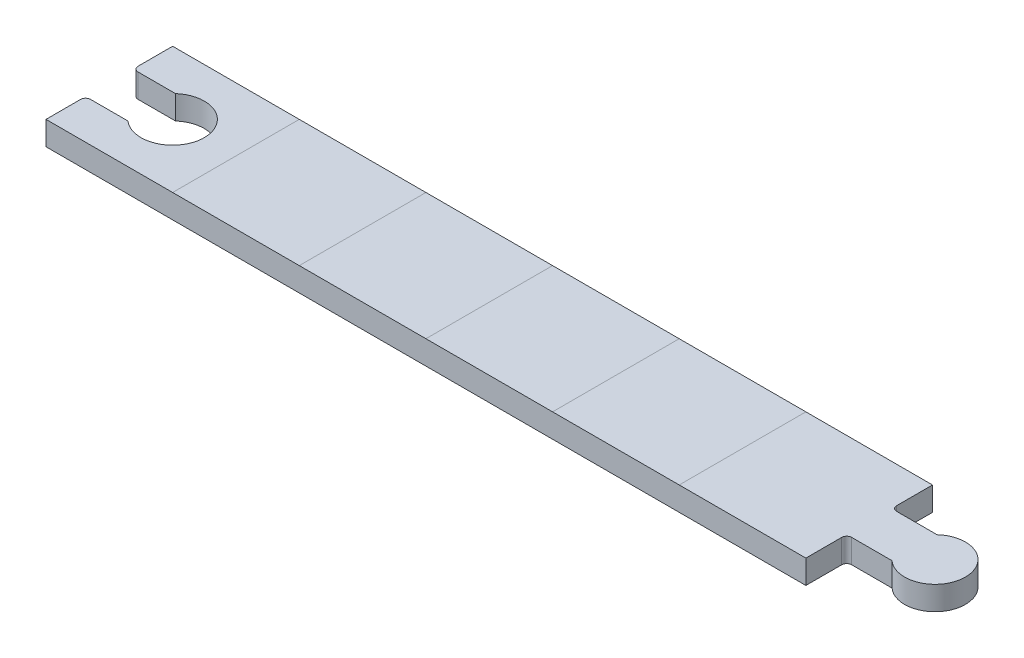
ISO-10303-21;
HEADER;
FILE_DESCRIPTION(('STEP AP214'),'2;1');
FILE_NAME('part.step','',(''),(''),'','','');
FILE_SCHEMA(('AUTOMOTIVE_DESIGN { 1 0 10303 214 1 1 1 1 }'));
ENDSEC;
DATA;
#1=APPLICATION_CONTEXT('core data for automotive mechanical design processes');
#2=APPLICATION_PROTOCOL_DEFINITION('international standard','automotive_design',2000,#1);
#3=PRODUCT_CONTEXT('',#1,'mechanical');
#4=PRODUCT('Part','Part','',(#3));
#5=PRODUCT_RELATED_PRODUCT_CATEGORY('part','',(#4));
#6=PRODUCT_DEFINITION_FORMATION('','',#4);
#7=PRODUCT_DEFINITION_CONTEXT('part definition',#1,'design');
#8=PRODUCT_DEFINITION('design','',#6,#7);
#9=PRODUCT_DEFINITION_SHAPE('','',#8);
#10=(LENGTH_UNIT() NAMED_UNIT(*) SI_UNIT(.MILLI.,.METRE.));
#11=(NAMED_UNIT(*) PLANE_ANGLE_UNIT() SI_UNIT($,.RADIAN.));
#12=(NAMED_UNIT(*) SI_UNIT($,.STERADIAN.) SOLID_ANGLE_UNIT());
#13=UNCERTAINTY_MEASURE_WITH_UNIT(LENGTH_MEASURE(1.E-05),#10,'distance_accuracy_value','');
#14=(GEOMETRIC_REPRESENTATION_CONTEXT(3) GLOBAL_UNCERTAINTY_ASSIGNED_CONTEXT((#13)) GLOBAL_UNIT_ASSIGNED_CONTEXT((#10,
#11,#12)) REPRESENTATION_CONTEXT('',''));
#15=CARTESIAN_POINT('',(0.,0.,0.));
#16=DIRECTION('',(0.,0.,1.));
#17=DIRECTION('',(1.,0.,0.));
#18=AXIS2_PLACEMENT_3D('',#15,#16,#17);
#19=CARTESIAN_POINT('',(-63.5,4.7625,0.));
#20=DIRECTION('',(0.,1.,0.));
#21=DIRECTION('',(0.,0.,1.));
#22=AXIS2_PLACEMENT_3D('',#19,#20,#21);
#23=PLANE('',#22);
#24=DIRECTION('',(1.,0.,0.));
#25=VECTOR('',#24,1.);
#26=CARTESIAN_POINT('',(-76.2,4.7625,12.7));
#27=LINE('',#26,#25);
#28=CARTESIAN_POINT('',(25.4,4.7625,12.7));
#29=VERTEX_POINT('',#28);
#30=CARTESIAN_POINT('',(50.8,4.7625,12.7));
#31=VERTEX_POINT('',#30);
#32=EDGE_CURVE('E381',#29,#31,#27,.T.);
#33=ORIENTED_EDGE('',*,*,#32,.T.);
#34=DIRECTION('',(0.,0.,-1.));
#35=VECTOR('',#34,1.);
#36=CARTESIAN_POINT('',(50.8,4.7625,0.));
#37=LINE('',#36,#35);
#38=CARTESIAN_POINT('',(50.8,4.7625,-12.7));
#39=VERTEX_POINT('',#38);
#40=EDGE_CURVE('E11',#31,#39,#37,.T.);
#41=ORIENTED_EDGE('',*,*,#40,.T.);
#42=DIRECTION('',(-1.,0.,0.));
#43=VECTOR('',#42,1.);
#44=CARTESIAN_POINT('',(-76.2,4.7625,-12.7));
#45=LINE('',#44,#43);
#46=CARTESIAN_POINT('',(25.4,4.7625,-12.7));
#47=VERTEX_POINT('',#46);
#48=EDGE_CURVE('E197',#39,#47,#45,.T.);
#49=ORIENTED_EDGE('',*,*,#48,.T.);
#50=DIRECTION('',(0.,0.,-1.));
#51=VECTOR('',#50,1.);
#52=CARTESIAN_POINT('',(25.4,4.7625,0.));
#53=LINE('',#52,#51);
#54=EDGE_CURVE('E48',#29,#47,#53,.T.);
#55=ORIENTED_EDGE('',*,*,#54,.F.);
#56=EDGE_LOOP('',(#33,#41,#49,#55));
#57=FACE_BOUND('',#56,.T.);
#58=ADVANCED_FACE('F39',(#57),#23,.T.);
#59=CARTESIAN_POINT('',(0.,4.7625,12.7));
#60=VERTEX_POINT('',#59);
#61=EDGE_CURVE('E265',#60,#29,#27,.T.);
#62=ORIENTED_EDGE('',*,*,#61,.T.);
#63=ORIENTED_EDGE('',*,*,#54,.T.);
#64=CARTESIAN_POINT('',(0.,4.7625,-12.7));
#65=VERTEX_POINT('',#64);
#66=EDGE_CURVE('E263',#47,#65,#45,.T.);
#67=ORIENTED_EDGE('',*,*,#66,.T.);
#68=DIRECTION('',(0.,0.,-1.));
#69=VECTOR('',#68,1.);
#70=CARTESIAN_POINT('',(0.,4.7625,0.));
#71=LINE('',#70,#69);
#72=EDGE_CURVE('E253',#60,#65,#71,.T.);
#73=ORIENTED_EDGE('',*,*,#72,.F.);
#74=EDGE_LOOP('',(#62,#63,#67,#73));
#75=FACE_BOUND('',#74,.T.);
#76=ADVANCED_FACE('F262',(#75),#23,.T.);
#77=CARTESIAN_POINT('',(-25.4,4.7625,12.7));
#78=VERTEX_POINT('',#77);
#79=EDGE_CURVE('E380',#78,#60,#27,.T.);
#80=ORIENTED_EDGE('',*,*,#79,.T.);
#81=ORIENTED_EDGE('',*,*,#72,.T.);
#82=CARTESIAN_POINT('',(-25.4,4.7625,-12.7));
#83=VERTEX_POINT('',#82);
#84=EDGE_CURVE('E269',#65,#83,#45,.T.);
#85=ORIENTED_EDGE('',*,*,#84,.T.);
#86=DIRECTION('',(0.,0.,-1.));
#87=VECTOR('',#86,1.);
#88=CARTESIAN_POINT('',(-25.4,4.7625,0.));
#89=LINE('',#88,#87);
#90=EDGE_CURVE('E249',#78,#83,#89,.T.);
#91=ORIENTED_EDGE('',*,*,#90,.F.);
#92=EDGE_LOOP('',(#80,#81,#85,#91));
#93=FACE_BOUND('',#92,.T.);
#94=ADVANCED_FACE('F379',(#93),#23,.T.);
#95=CARTESIAN_POINT('',(-50.8,4.7625,12.7));
#96=VERTEX_POINT('',#95);
#97=EDGE_CURVE('E288',#96,#78,#27,.T.);
#98=ORIENTED_EDGE('',*,*,#97,.T.);
#99=ORIENTED_EDGE('',*,*,#90,.T.);
#100=CARTESIAN_POINT('',(-50.8,4.7625,-12.7));
#101=VERTEX_POINT('',#100);
#102=EDGE_CURVE('E270',#83,#101,#45,.T.);
#103=ORIENTED_EDGE('',*,*,#102,.T.);
#104=DIRECTION('',(0.,0.,-1.));
#105=VECTOR('',#104,1.);
#106=CARTESIAN_POINT('',(-50.8,4.7625,0.));
#107=LINE('',#106,#105);
#108=EDGE_CURVE('E245',#96,#101,#107,.T.);
#109=ORIENTED_EDGE('',*,*,#108,.F.);
#110=EDGE_LOOP('',(#98,#99,#103,#109));
#111=FACE_BOUND('',#110,.T.);
#112=ADVANCED_FACE('F376',(#111),#23,.T.);
#113=CARTESIAN_POINT('',(-76.2,4.7625,12.7));
#114=VERTEX_POINT('',#113);
#115=EDGE_CURVE('E284',#114,#96,#27,.T.);
#116=ORIENTED_EDGE('',*,*,#115,.T.);
#117=ORIENTED_EDGE('',*,*,#108,.T.);
#118=CARTESIAN_POINT('',(-76.2,4.7625,-12.7));
#119=VERTEX_POINT('',#118);
#120=EDGE_CURVE('E189',#101,#119,#45,.T.);
#121=ORIENTED_EDGE('',*,*,#120,.T.);
#122=DIRECTION('',(0.,0.,1.));
#123=VECTOR('',#122,1.);
#124=CARTESIAN_POINT('',(-76.2,4.7625,-4.7625));
#125=LINE('',#124,#123);
#126=CARTESIAN_POINT('',(-76.2,4.7625,-5.7625));
#127=VERTEX_POINT('',#126);
#128=EDGE_CURVE('E198',#119,#127,#125,.T.);
#129=ORIENTED_EDGE('',*,*,#128,.T.);
#130=CARTESIAN_POINT('',(-75.2,4.7625,-5.7625));
#131=DIRECTION('',(0.,1.,0.));
#132=DIRECTION('',(0.,0.,1.));
#133=AXIS2_PLACEMENT_3D('',#130,#131,#132);
#134=CIRCLE('',#133,1.);
#135=CARTESIAN_POINT('',(-75.2,4.7625,-4.7625));
#136=VERTEX_POINT('',#135);
#137=EDGE_CURVE('E220',#127,#136,#134,.T.);
#138=ORIENTED_EDGE('',*,*,#137,.T.);
#139=DIRECTION('',(1.,0.,0.));
#140=VECTOR('',#139,1.);
#141=CARTESIAN_POINT('',(-67.700130206315,4.7625,-4.7625));
#142=LINE('',#141,#140);
#143=CARTESIAN_POINT('',(-67.700130206315,4.7625,-4.7625));
#144=VERTEX_POINT('',#143);
#145=EDGE_CURVE('E274',#136,#144,#142,.T.);
#146=ORIENTED_EDGE('',*,*,#145,.T.);
#147=CARTESIAN_POINT('',(-63.5,4.7625,0.));
#148=DIRECTION('',(0.,-1.,0.));
#149=DIRECTION('',(0.,0.,1.));
#150=AXIS2_PLACEMENT_3D('',#147,#148,#149);
#151=CIRCLE('',#150,6.35);
#152=CARTESIAN_POINT('',(-67.700130206315,4.7625,4.7625));
#153=VERTEX_POINT('',#152);
#154=EDGE_CURVE('E276',#144,#153,#151,.T.);
#155=ORIENTED_EDGE('',*,*,#154,.T.);
#156=DIRECTION('',(-1.,0.,0.));
#157=VECTOR('',#156,1.);
#158=CARTESIAN_POINT('',(-76.2,4.7625,4.7625));
#159=LINE('',#158,#157);
#160=CARTESIAN_POINT('',(-75.2,4.7625,4.7625));
#161=VERTEX_POINT('',#160);
#162=EDGE_CURVE('E278',#153,#161,#159,.T.);
#163=ORIENTED_EDGE('',*,*,#162,.T.);
#164=CARTESIAN_POINT('',(-75.2,4.7625,5.7625));
#165=DIRECTION('',(0.,1.,0.));
#166=DIRECTION('',(0.,0.,1.));
#167=AXIS2_PLACEMENT_3D('',#164,#165,#166);
#168=CIRCLE('',#167,1.);
#169=CARTESIAN_POINT('',(-76.2,4.7625,5.7625));
#170=VERTEX_POINT('',#169);
#171=EDGE_CURVE('E222',#161,#170,#168,.T.);
#172=ORIENTED_EDGE('',*,*,#171,.T.);
#173=DIRECTION('',(0.,0.,1.));
#174=VECTOR('',#173,1.);
#175=CARTESIAN_POINT('',(-76.2,4.7625,12.7));
#176=LINE('',#175,#174);
#177=EDGE_CURVE('E281',#170,#114,#176,.T.);
#178=ORIENTED_EDGE('',*,*,#177,.T.);
#179=EDGE_LOOP('',(#116,#117,#121,#129,#138,#146,#155,#163,#172,#178));
#180=FACE_BOUND('',#179,.T.);
#181=ADVANCED_FACE('F361',(#180),#23,.T.);
#182=CARTESIAN_POINT('',(76.2,4.7625,-4.5125));
#183=DIRECTION('',(-1.,0.,0.));
#184=DIRECTION('',(0.,0.,1.));
#185=AXIS2_PLACEMENT_3D('',#182,#183,#184);
#186=PLANE('',#185);
#187=DIRECTION('',(0.,0.,-1.));
#188=VECTOR('',#187,1.);
#189=CARTESIAN_POINT('',(76.2,4.7625,-4.5125));
#190=LINE('',#189,#188);
#191=CARTESIAN_POINT('',(76.2,4.7625,-5.5125));
#192=VERTEX_POINT('',#191);
#193=CARTESIAN_POINT('',(76.2,4.7625,-12.7));
#194=VERTEX_POINT('',#193);
#195=EDGE_CURVE('E178',#192,#194,#190,.T.);
#196=ORIENTED_EDGE('',*,*,#195,.F.);
#197=DIRECTION('',(0.,-1.,0.));
#198=VECTOR('',#197,1.);
#199=CARTESIAN_POINT('',(76.2,0.,-5.5125));
#200=LINE('',#199,#198);
#201=CARTESIAN_POINT('',(76.2,0.,-5.5125));
#202=VERTEX_POINT('',#201);
#203=EDGE_CURVE('E229',#192,#202,#200,.T.);
#204=ORIENTED_EDGE('',*,*,#203,.T.);
#205=DIRECTION('',(0.,0.,-1.));
#206=VECTOR('',#205,1.);
#207=CARTESIAN_POINT('',(76.2,0.,-4.5125));
#208=LINE('',#207,#206);
#209=CARTESIAN_POINT('',(76.2,0.,-12.7));
#210=VERTEX_POINT('',#209);
#211=EDGE_CURVE('E202',#202,#210,#208,.T.);
#212=ORIENTED_EDGE('',*,*,#211,.T.);
#213=DIRECTION('',(0.,-1.,0.));
#214=VECTOR('',#213,1.);
#215=CARTESIAN_POINT('',(76.2,4.7625,-12.7));
#216=LINE('',#215,#214);
#217=EDGE_CURVE('E195',#194,#210,#216,.T.);
#218=ORIENTED_EDGE('',*,*,#217,.F.);
#219=EDGE_LOOP('',(#196,#204,#212,#218));
#220=FACE_BOUND('',#219,.T.);
#221=ADVANCED_FACE('F200',(#220),#186,.F.);
#222=CARTESIAN_POINT('',(-76.2,4.7625,-12.7));
#223=DIRECTION('',(0.,0.,1.));
#224=DIRECTION('',(1.,0.,0.));
#225=AXIS2_PLACEMENT_3D('',#222,#223,#224);
#226=PLANE('',#225);
#227=DIRECTION('',(-1.,0.,0.));
#228=VECTOR('',#227,1.);
#229=CARTESIAN_POINT('',(-76.2,0.,-12.7));
#230=LINE('',#229,#228);
#231=CARTESIAN_POINT('',(-76.2,0.,-12.7));
#232=VERTEX_POINT('',#231);
#233=EDGE_CURVE('E299',#210,#232,#230,.T.);
#234=ORIENTED_EDGE('',*,*,#233,.T.);
#235=DIRECTION('',(0.,-1.,0.));
#236=VECTOR('',#235,1.);
#237=CARTESIAN_POINT('',(-76.2,4.7625,-12.7));
#238=LINE('',#237,#236);
#239=EDGE_CURVE('E205',#119,#232,#238,.T.);
#240=ORIENTED_EDGE('',*,*,#239,.F.);
#241=ORIENTED_EDGE('',*,*,#120,.F.);
#242=ORIENTED_EDGE('',*,*,#102,.F.);
#243=ORIENTED_EDGE('',*,*,#84,.F.);
#244=ORIENTED_EDGE('',*,*,#66,.F.);
#245=ORIENTED_EDGE('',*,*,#48,.F.);
#246=EDGE_CURVE('E181',#194,#39,#45,.T.);
#247=ORIENTED_EDGE('',*,*,#246,.F.);
#248=ORIENTED_EDGE('',*,*,#217,.T.);
#249=EDGE_LOOP('',(#234,#240,#241,#242,#243,#244,#245,#247,#248));
#250=FACE_BOUND('',#249,.T.);
#251=ADVANCED_FACE('F194',(#250),#226,.F.);
#252=CARTESIAN_POINT('',(-76.2,4.7625,-4.7625));
#253=DIRECTION('',(1.,0.,0.));
#254=DIRECTION('',(0.,0.,-1.));
#255=AXIS2_PLACEMENT_3D('',#252,#253,#254);
#256=PLANE('',#255);
#257=DIRECTION('',(0.,0.,1.));
#258=VECTOR('',#257,1.);
#259=CARTESIAN_POINT('',(-76.2,0.,-4.7625));
#260=LINE('',#259,#258);
#261=CARTESIAN_POINT('',(-76.2,0.,-5.7625));
#262=VERTEX_POINT('',#261);
#263=EDGE_CURVE('E301',#232,#262,#260,.T.);
#264=ORIENTED_EDGE('',*,*,#263,.T.);
#265=DIRECTION('',(0.,-1.,0.));
#266=VECTOR('',#265,1.);
#267=CARTESIAN_POINT('',(-76.2,4.7625,-5.7625));
#268=LINE('',#267,#266);
#269=EDGE_CURVE('E227',#262,#127,#268,.F.);
#270=ORIENTED_EDGE('',*,*,#269,.T.);
#271=ORIENTED_EDGE('',*,*,#128,.F.);
#272=ORIENTED_EDGE('',*,*,#239,.T.);
#273=EDGE_LOOP('',(#264,#270,#271,#272));
#274=FACE_BOUND('',#273,.T.);
#275=ADVANCED_FACE('F409',(#274),#256,.F.);
#276=CARTESIAN_POINT('',(-67.700130206315,4.7625,-4.7625));
#277=DIRECTION('',(0.,0.,-1.));
#278=DIRECTION('',(-1.,0.,0.));
#279=AXIS2_PLACEMENT_3D('',#276,#277,#278);
#280=PLANE('',#279);
#281=ORIENTED_EDGE('',*,*,#145,.F.);
#282=DIRECTION('',(0.,-1.,0.));
#283=VECTOR('',#282,1.);
#284=CARTESIAN_POINT('',(-75.2,4.7625,-4.7625));
#285=LINE('',#284,#283);
#286=CARTESIAN_POINT('',(-75.2,0.,-4.7625));
#287=VERTEX_POINT('',#286);
#288=EDGE_CURVE('E224',#136,#287,#285,.T.);
#289=ORIENTED_EDGE('',*,*,#288,.T.);
#290=DIRECTION('',(1.,0.,0.));
#291=VECTOR('',#290,1.);
#292=CARTESIAN_POINT('',(-67.700130206315,0.,-4.7625));
#293=LINE('',#292,#291);
#294=CARTESIAN_POINT('',(-67.700130206315,0.,-4.7625));
#295=VERTEX_POINT('',#294);
#296=EDGE_CURVE('E304',#287,#295,#293,.T.);
#297=ORIENTED_EDGE('',*,*,#296,.T.);
#298=DIRECTION('',(0.,-1.,0.));
#299=VECTOR('',#298,1.);
#300=CARTESIAN_POINT('',(-67.700130206315,4.7625,-4.7625));
#301=LINE('',#300,#299);
#302=EDGE_CURVE('E211',#144,#295,#301,.T.);
#303=ORIENTED_EDGE('',*,*,#302,.F.);
#304=EDGE_LOOP('',(#281,#289,#297,#303));
#305=FACE_BOUND('',#304,.T.);
#306=ADVANCED_FACE('F415',(#305),#280,.F.);
#307=CARTESIAN_POINT('',(-63.5,4.7625,0.));
#308=DIRECTION('',(0.,-1.,0.));
#309=DIRECTION('',(0.,0.,-1.));
#310=AXIS2_PLACEMENT_3D('',#307,#308,#309);
#311=CYLINDRICAL_SURFACE('',#310,6.35);
#312=CARTESIAN_POINT('',(-63.5,0.,0.));
#313=DIRECTION('',(0.,-1.,0.));
#314=DIRECTION('',(0.,0.,1.));
#315=AXIS2_PLACEMENT_3D('',#312,#313,#314);
#316=CIRCLE('',#315,6.35);
#317=CARTESIAN_POINT('',(-67.700130206315,0.,4.7625));
#318=VERTEX_POINT('',#317);
#319=EDGE_CURVE('E306',#295,#318,#316,.T.);
#320=ORIENTED_EDGE('',*,*,#319,.T.);
#321=DIRECTION('',(0.,-1.,0.));
#322=VECTOR('',#321,1.);
#323=CARTESIAN_POINT('',(-67.700130206315,4.7625,4.7625));
#324=LINE('',#323,#322);
#325=EDGE_CURVE('E335',#153,#318,#324,.T.);
#326=ORIENTED_EDGE('',*,*,#325,.F.);
#327=ORIENTED_EDGE('',*,*,#154,.F.);
#328=ORIENTED_EDGE('',*,*,#302,.T.);
#329=EDGE_LOOP('',(#320,#326,#327,#328));
#330=FACE_BOUND('',#329,.T.);
#331=ADVANCED_FACE('F342',(#330),#311,.F.);
#332=CARTESIAN_POINT('',(-76.2,4.7625,4.7625));
#333=DIRECTION('',(0.,0.,1.));
#334=DIRECTION('',(1.,0.,0.));
#335=AXIS2_PLACEMENT_3D('',#332,#333,#334);
#336=PLANE('',#335);
#337=DIRECTION('',(-1.,0.,0.));
#338=VECTOR('',#337,1.);
#339=CARTESIAN_POINT('',(-76.2,0.,4.7625));
#340=LINE('',#339,#338);
#341=CARTESIAN_POINT('',(-75.2,0.,4.7625));
#342=VERTEX_POINT('',#341);
#343=EDGE_CURVE('E308',#318,#342,#340,.T.);
#344=ORIENTED_EDGE('',*,*,#343,.T.);
#345=DIRECTION('',(0.,-1.,0.));
#346=VECTOR('',#345,1.);
#347=CARTESIAN_POINT('',(-75.2,4.7625,4.7625));
#348=LINE('',#347,#346);
#349=EDGE_CURVE('E218',#342,#161,#348,.F.);
#350=ORIENTED_EDGE('',*,*,#349,.T.);
#351=ORIENTED_EDGE('',*,*,#162,.F.);
#352=ORIENTED_EDGE('',*,*,#325,.T.);
#353=EDGE_LOOP('',(#344,#350,#351,#352));
#354=FACE_BOUND('',#353,.T.);
#355=ADVANCED_FACE('F353',(#354),#336,.F.);
#356=CARTESIAN_POINT('',(-76.2,4.7625,12.7));
#357=DIRECTION('',(1.,0.,0.));
#358=DIRECTION('',(0.,0.,-1.));
#359=AXIS2_PLACEMENT_3D('',#356,#357,#358);
#360=PLANE('',#359);
#361=ORIENTED_EDGE('',*,*,#177,.F.);
#362=DIRECTION('',(0.,-1.,0.));
#363=VECTOR('',#362,1.);
#364=CARTESIAN_POINT('',(-76.2,4.7625,5.7625));
#365=LINE('',#364,#363);
#366=CARTESIAN_POINT('',(-76.2,0.,5.7625));
#367=VERTEX_POINT('',#366);
#368=EDGE_CURVE('E204',#170,#367,#365,.T.);
#369=ORIENTED_EDGE('',*,*,#368,.T.);
#370=DIRECTION('',(0.,0.,1.));
#371=VECTOR('',#370,1.);
#372=CARTESIAN_POINT('',(-76.2,0.,12.7));
#373=LINE('',#372,#371);
#374=CARTESIAN_POINT('',(-76.2,0.,12.7));
#375=VERTEX_POINT('',#374);
#376=EDGE_CURVE('E311',#367,#375,#373,.T.);
#377=ORIENTED_EDGE('',*,*,#376,.T.);
#378=DIRECTION('',(0.,-1.,0.));
#379=VECTOR('',#378,1.);
#380=CARTESIAN_POINT('',(-76.2,4.7625,12.7));
#381=LINE('',#380,#379);
#382=EDGE_CURVE('E332',#114,#375,#381,.T.);
#383=ORIENTED_EDGE('',*,*,#382,.F.);
#384=EDGE_LOOP('',(#361,#369,#377,#383));
#385=FACE_BOUND('',#384,.T.);
#386=ADVANCED_FACE('F364',(#385),#360,.F.);
#387=CARTESIAN_POINT('',(-76.2,4.7625,12.7));
#388=DIRECTION('',(0.,0.,-1.));
#389=DIRECTION('',(-1.,0.,0.));
#390=AXIS2_PLACEMENT_3D('',#387,#388,#389);
#391=PLANE('',#390);
#392=DIRECTION('',(1.,0.,0.));
#393=VECTOR('',#392,1.);
#394=CARTESIAN_POINT('',(-76.2,0.,12.7));
#395=LINE('',#394,#393);
#396=CARTESIAN_POINT('',(76.2,0.,12.7));
#397=VERTEX_POINT('',#396);
#398=EDGE_CURVE('E313',#375,#397,#395,.T.);
#399=ORIENTED_EDGE('',*,*,#398,.T.);
#400=DIRECTION('',(0.,-1.,0.));
#401=VECTOR('',#400,1.);
#402=CARTESIAN_POINT('',(76.2,4.7625,12.7));
#403=LINE('',#402,#401);
#404=CARTESIAN_POINT('',(76.2,4.7625,12.7));
#405=VERTEX_POINT('',#404);
#406=EDGE_CURVE('E329',#405,#397,#403,.T.);
#407=ORIENTED_EDGE('',*,*,#406,.F.);
#408=EDGE_CURVE('E283',#31,#405,#27,.T.);
#409=ORIENTED_EDGE('',*,*,#408,.F.);
#410=ORIENTED_EDGE('',*,*,#32,.F.);
#411=ORIENTED_EDGE('',*,*,#61,.F.);
#412=ORIENTED_EDGE('',*,*,#79,.F.);
#413=ORIENTED_EDGE('',*,*,#97,.F.);
#414=ORIENTED_EDGE('',*,*,#115,.F.);
#415=ORIENTED_EDGE('',*,*,#382,.T.);
#416=EDGE_LOOP('',(#399,#407,#409,#410,#411,#412,#413,#414,#415));
#417=FACE_BOUND('',#416,.T.);
#418=ADVANCED_FACE('F369',(#417),#391,.F.);
#419=CARTESIAN_POINT('',(76.2,4.7625,12.7));
#420=DIRECTION('',(-1.,0.,0.));
#421=DIRECTION('',(0.,0.,1.));
#422=AXIS2_PLACEMENT_3D('',#419,#420,#421);
#423=PLANE('',#422);
#424=DIRECTION('',(0.,0.,-1.));
#425=VECTOR('',#424,1.);
#426=CARTESIAN_POINT('',(76.2,0.,12.7));
#427=LINE('',#426,#425);
#428=CARTESIAN_POINT('',(76.2,0.,5.5125));
#429=VERTEX_POINT('',#428);
#430=EDGE_CURVE('E315',#397,#429,#427,.T.);
#431=ORIENTED_EDGE('',*,*,#430,.T.);
#432=DIRECTION('',(0.,-1.,0.));
#433=VECTOR('',#432,1.);
#434=CARTESIAN_POINT('',(76.2,4.7625,5.5125));
#435=LINE('',#434,#433);
#436=CARTESIAN_POINT('',(76.2,4.7625,5.5125));
#437=VERTEX_POINT('',#436);
#438=EDGE_CURVE('E236',#429,#437,#435,.F.);
#439=ORIENTED_EDGE('',*,*,#438,.T.);
#440=DIRECTION('',(0.,0.,-1.));
#441=VECTOR('',#440,1.);
#442=CARTESIAN_POINT('',(76.2,4.7625,12.7));
#443=LINE('',#442,#441);
#444=EDGE_CURVE('E287',#405,#437,#443,.T.);
#445=ORIENTED_EDGE('',*,*,#444,.F.);
#446=ORIENTED_EDGE('',*,*,#406,.T.);
#447=EDGE_LOOP('',(#431,#439,#445,#446));
#448=FACE_BOUND('',#447,.T.);
#449=ADVANCED_FACE('F387',(#448),#423,.F.);
#450=CARTESIAN_POINT('',(76.2,4.7625,4.5125));
#451=DIRECTION('',(0.,0.,-1.));
#452=DIRECTION('',(-1.,0.,0.));
#453=AXIS2_PLACEMENT_3D('',#450,#451,#452);
#454=PLANE('',#453);
#455=DIRECTION('',(1.,0.,0.));
#456=VECTOR('',#455,1.);
#457=CARTESIAN_POINT('',(76.2,4.7625,4.5125));
#458=LINE('',#457,#456);
#459=CARTESIAN_POINT('',(77.2,4.7625,4.5125));
#460=VERTEX_POINT('',#459);
#461=CARTESIAN_POINT('',(85.2954484106056,4.7625,4.5125));
#462=VERTEX_POINT('',#461);
#463=EDGE_CURVE('E291',#460,#462,#458,.T.);
#464=ORIENTED_EDGE('',*,*,#463,.F.);
#465=DIRECTION('',(0.,-1.,0.));
#466=VECTOR('',#465,1.);
#467=CARTESIAN_POINT('',(77.2,0.,4.5125));
#468=LINE('',#467,#466);
#469=CARTESIAN_POINT('',(77.2,0.,4.5125));
#470=VERTEX_POINT('',#469);
#471=EDGE_CURVE('E233',#460,#470,#468,.T.);
#472=ORIENTED_EDGE('',*,*,#471,.T.);
#473=DIRECTION('',(1.,0.,0.));
#474=VECTOR('',#473,1.);
#475=CARTESIAN_POINT('',(76.2,0.,4.5125));
#476=LINE('',#475,#474);
#477=CARTESIAN_POINT('',(85.2954484106056,0.,4.5125));
#478=VERTEX_POINT('',#477);
#479=EDGE_CURVE('E318',#470,#478,#476,.T.);
#480=ORIENTED_EDGE('',*,*,#479,.T.);
#481=DIRECTION('',(0.,-1.,0.));
#482=VECTOR('',#481,1.);
#483=CARTESIAN_POINT('',(85.2954484106056,4.7625,4.5125));
#484=LINE('',#483,#482);
#485=EDGE_CURVE('E326',#462,#478,#484,.T.);
#486=ORIENTED_EDGE('',*,*,#485,.F.);
#487=EDGE_LOOP('',(#464,#472,#480,#486));
#488=FACE_BOUND('',#487,.T.);
#489=ADVANCED_FACE('F394',(#488),#454,.F.);
#490=CARTESIAN_POINT('',(89.4,4.7625,0.));
#491=DIRECTION('',(0.,-1.,0.));
#492=DIRECTION('',(0.,0.,-1.));
#493=AXIS2_PLACEMENT_3D('',#490,#491,#492);
#494=CYLINDRICAL_SURFACE('',#493,6.1);
#495=CARTESIAN_POINT('',(89.4,0.,0.));
#496=DIRECTION('',(0.,1.,0.));
#497=DIRECTION('',(0.,0.,1.));
#498=AXIS2_PLACEMENT_3D('',#495,#496,#497);
#499=CIRCLE('',#498,6.1);
#500=CARTESIAN_POINT('',(85.2954484106056,0.,-4.5125));
#501=VERTEX_POINT('',#500);
#502=EDGE_CURVE('E320',#478,#501,#499,.T.);
#503=ORIENTED_EDGE('',*,*,#502,.T.);
#504=DIRECTION('',(0.,-1.,0.));
#505=VECTOR('',#504,1.);
#506=CARTESIAN_POINT('',(85.2954484106056,4.7625,-4.5125));
#507=LINE('',#506,#505);
#508=CARTESIAN_POINT('',(85.2954484106056,4.7625,-4.5125));
#509=VERTEX_POINT('',#508);
#510=EDGE_CURVE('E297',#509,#501,#507,.T.);
#511=ORIENTED_EDGE('',*,*,#510,.F.);
#512=CARTESIAN_POINT('',(89.4,4.7625,0.));
#513=DIRECTION('',(0.,1.,0.));
#514=DIRECTION('',(0.,0.,1.));
#515=AXIS2_PLACEMENT_3D('',#512,#513,#514);
#516=CIRCLE('',#515,6.1);
#517=EDGE_CURVE('E293',#462,#509,#516,.T.);
#518=ORIENTED_EDGE('',*,*,#517,.F.);
#519=ORIENTED_EDGE('',*,*,#485,.T.);
#520=EDGE_LOOP('',(#503,#511,#518,#519));
#521=FACE_BOUND('',#520,.T.);
#522=ADVANCED_FACE('F400',(#521),#494,.T.);
#523=CARTESIAN_POINT('',(76.2,4.7625,-4.5125));
#524=DIRECTION('',(0.,0.,1.));
#525=DIRECTION('',(1.,0.,0.));
#526=AXIS2_PLACEMENT_3D('',#523,#524,#525);
#527=PLANE('',#526);
#528=DIRECTION('',(-1.,0.,0.));
#529=VECTOR('',#528,1.);
#530=CARTESIAN_POINT('',(76.2,0.,-4.5125));
#531=LINE('',#530,#529);
#532=CARTESIAN_POINT('',(77.2,0.,-4.5125));
#533=VERTEX_POINT('',#532);
#534=EDGE_CURVE('E190',#501,#533,#531,.T.);
#535=ORIENTED_EDGE('',*,*,#534,.T.);
#536=DIRECTION('',(0.,-1.,0.));
#537=VECTOR('',#536,1.);
#538=CARTESIAN_POINT('',(77.2,4.7625,-4.5125));
#539=LINE('',#538,#537);
#540=CARTESIAN_POINT('',(77.2,4.7625,-4.5125));
#541=VERTEX_POINT('',#540);
#542=EDGE_CURVE('E231',#533,#541,#539,.F.);
#543=ORIENTED_EDGE('',*,*,#542,.T.);
#544=DIRECTION('',(-1.,0.,0.));
#545=VECTOR('',#544,1.);
#546=CARTESIAN_POINT('',(76.2,4.7625,-4.5125));
#547=LINE('',#546,#545);
#548=EDGE_CURVE('E295',#509,#541,#547,.T.);
#549=ORIENTED_EDGE('',*,*,#548,.F.);
#550=ORIENTED_EDGE('',*,*,#510,.T.);
#551=EDGE_LOOP('',(#535,#543,#549,#550));
#552=FACE_BOUND('',#551,.T.);
#553=ADVANCED_FACE('F431',(#552),#527,.F.);
#554=ORIENTED_EDGE('',*,*,#40,.F.);
#555=ORIENTED_EDGE('',*,*,#408,.T.);
#556=ORIENTED_EDGE('',*,*,#444,.T.);
#557=CARTESIAN_POINT('',(77.2,4.7625,5.5125));
#558=DIRECTION('',(0.,1.,0.));
#559=DIRECTION('',(0.,0.,1.));
#560=AXIS2_PLACEMENT_3D('',#557,#558,#559);
#561=CIRCLE('',#560,1.);
#562=EDGE_CURVE('E243',#437,#460,#561,.F.);
#563=ORIENTED_EDGE('',*,*,#562,.T.);
#564=ORIENTED_EDGE('',*,*,#463,.T.);
#565=ORIENTED_EDGE('',*,*,#517,.T.);
#566=ORIENTED_EDGE('',*,*,#548,.T.);
#567=CARTESIAN_POINT('',(77.2,4.7625,-5.5125));
#568=DIRECTION('',(0.,1.,0.));
#569=DIRECTION('',(0.,0.,1.));
#570=AXIS2_PLACEMENT_3D('',#567,#568,#569);
#571=CIRCLE('',#570,1.);
#572=EDGE_CURVE('E184',#541,#192,#571,.F.);
#573=ORIENTED_EDGE('',*,*,#572,.T.);
#574=ORIENTED_EDGE('',*,*,#195,.T.);
#575=ORIENTED_EDGE('',*,*,#246,.T.);
#576=EDGE_LOOP('',(#554,#555,#556,#563,#564,#565,#566,#573,#574,#575));
#577=FACE_BOUND('',#576,.T.);
#578=ADVANCED_FACE('F180',(#577),#23,.T.);
#579=CARTESIAN_POINT('',(-63.5,0.,0.));
#580=DIRECTION('',(0.,1.,0.));
#581=DIRECTION('',(0.,0.,1.));
#582=AXIS2_PLACEMENT_3D('',#579,#580,#581);
#583=PLANE('',#582);
#584=ORIENTED_EDGE('',*,*,#376,.F.);
#585=CARTESIAN_POINT('',(-75.2,0.,5.7625));
#586=DIRECTION('',(0.,1.,0.));
#587=DIRECTION('',(0.,0.,1.));
#588=AXIS2_PLACEMENT_3D('',#585,#586,#587);
#589=CIRCLE('',#588,1.);
#590=EDGE_CURVE('E216',#367,#342,#589,.F.);
#591=ORIENTED_EDGE('',*,*,#590,.T.);
#592=ORIENTED_EDGE('',*,*,#343,.F.);
#593=ORIENTED_EDGE('',*,*,#319,.F.);
#594=ORIENTED_EDGE('',*,*,#296,.F.);
#595=CARTESIAN_POINT('',(-75.2,0.,-5.7625));
#596=DIRECTION('',(0.,1.,0.));
#597=DIRECTION('',(0.,0.,1.));
#598=AXIS2_PLACEMENT_3D('',#595,#596,#597);
#599=CIRCLE('',#598,1.);
#600=EDGE_CURVE('E208',#287,#262,#599,.F.);
#601=ORIENTED_EDGE('',*,*,#600,.T.);
#602=ORIENTED_EDGE('',*,*,#263,.F.);
#603=ORIENTED_EDGE('',*,*,#233,.F.);
#604=ORIENTED_EDGE('',*,*,#211,.F.);
#605=CARTESIAN_POINT('',(77.2,0.,-5.5125));
#606=DIRECTION('',(0.,1.,0.));
#607=DIRECTION('',(0.,0.,1.));
#608=AXIS2_PLACEMENT_3D('',#605,#606,#607);
#609=CIRCLE('',#608,1.);
#610=EDGE_CURVE('E238',#202,#533,#609,.T.);
#611=ORIENTED_EDGE('',*,*,#610,.T.);
#612=ORIENTED_EDGE('',*,*,#534,.F.);
#613=ORIENTED_EDGE('',*,*,#502,.F.);
#614=ORIENTED_EDGE('',*,*,#479,.F.);
#615=CARTESIAN_POINT('',(77.2,0.,5.5125));
#616=DIRECTION('',(0.,1.,0.));
#617=DIRECTION('',(0.,0.,1.));
#618=AXIS2_PLACEMENT_3D('',#615,#616,#617);
#619=CIRCLE('',#618,1.);
#620=EDGE_CURVE('E241',#470,#429,#619,.T.);
#621=ORIENTED_EDGE('',*,*,#620,.T.);
#622=ORIENTED_EDGE('',*,*,#430,.F.);
#623=ORIENTED_EDGE('',*,*,#398,.F.);
#624=EDGE_LOOP('',(#584,#591,#592,#593,#594,#601,#602,#603,#604,#611,#612,#613,#614,#621,#622,#623));
#625=FACE_BOUND('',#624,.T.);
#626=ADVANCED_FACE('F350',(#625),#583,.F.);
#627=CARTESIAN_POINT('',(-75.2,4.7625,5.7625));
#628=DIRECTION('',(0.,-1.,0.));
#629=DIRECTION('',(0.,0.,-1.));
#630=AXIS2_PLACEMENT_3D('',#627,#628,#629);
#631=CYLINDRICAL_SURFACE('',#630,1.);
#632=ORIENTED_EDGE('',*,*,#171,.F.);
#633=ORIENTED_EDGE('',*,*,#349,.F.);
#634=ORIENTED_EDGE('',*,*,#590,.F.);
#635=ORIENTED_EDGE('',*,*,#368,.F.);
#636=EDGE_LOOP('',(#632,#633,#634,#635));
#637=FACE_BOUND('',#636,.T.);
#638=ADVANCED_FACE('F357',(#637),#631,.T.);
#639=CARTESIAN_POINT('',(-75.2,4.7625,-5.7625));
#640=DIRECTION('',(0.,-1.,0.));
#641=DIRECTION('',(0.,0.,-1.));
#642=AXIS2_PLACEMENT_3D('',#639,#640,#641);
#643=CYLINDRICAL_SURFACE('',#642,1.);
#644=ORIENTED_EDGE('',*,*,#137,.F.);
#645=ORIENTED_EDGE('',*,*,#269,.F.);
#646=ORIENTED_EDGE('',*,*,#600,.F.);
#647=ORIENTED_EDGE('',*,*,#288,.F.);
#648=EDGE_LOOP('',(#644,#645,#646,#647));
#649=FACE_BOUND('',#648,.T.);
#650=ADVANCED_FACE('F414',(#649),#643,.T.);
#651=CARTESIAN_POINT('',(77.2,4.7625,-5.5125));
#652=DIRECTION('',(0.,1.,0.));
#653=DIRECTION('',(0.,0.,1.));
#654=AXIS2_PLACEMENT_3D('',#651,#652,#653);
#655=CYLINDRICAL_SURFACE('',#654,1.);
#656=ORIENTED_EDGE('',*,*,#572,.F.);
#657=ORIENTED_EDGE('',*,*,#542,.F.);
#658=ORIENTED_EDGE('',*,*,#610,.F.);
#659=ORIENTED_EDGE('',*,*,#203,.F.);
#660=EDGE_LOOP('',(#656,#657,#658,#659));
#661=FACE_BOUND('',#660,.T.);
#662=ADVANCED_FACE('F405',(#661),#655,.F.);
#663=CARTESIAN_POINT('',(77.2,4.7625,5.5125));
#664=DIRECTION('',(0.,1.,0.));
#665=DIRECTION('',(0.,0.,1.));
#666=AXIS2_PLACEMENT_3D('',#663,#664,#665);
#667=CYLINDRICAL_SURFACE('',#666,1.);
#668=ORIENTED_EDGE('',*,*,#562,.F.);
#669=ORIENTED_EDGE('',*,*,#438,.F.);
#670=ORIENTED_EDGE('',*,*,#620,.F.);
#671=ORIENTED_EDGE('',*,*,#471,.F.);
#672=EDGE_LOOP('',(#668,#669,#670,#671));
#673=FACE_BOUND('',#672,.T.);
#674=ADVANCED_FACE('F41',(#673),#667,.F.);
#675=CLOSED_SHELL('',(#58,#76,#94,#112,#181,#221,#251,#275,#306,#331,#355,#386,#418,#449,#489,
#522,#553,#578,#626,#638,#650,#662,#674));
#676=MANIFOLD_SOLID_BREP('B2',#675);
#677=ADVANCED_BREP_SHAPE_REPRESENTATION('',(#18,#676),#14);
#678=SHAPE_DEFINITION_REPRESENTATION(#9,#677);
ENDSEC;
END-ISO-10303-21;
